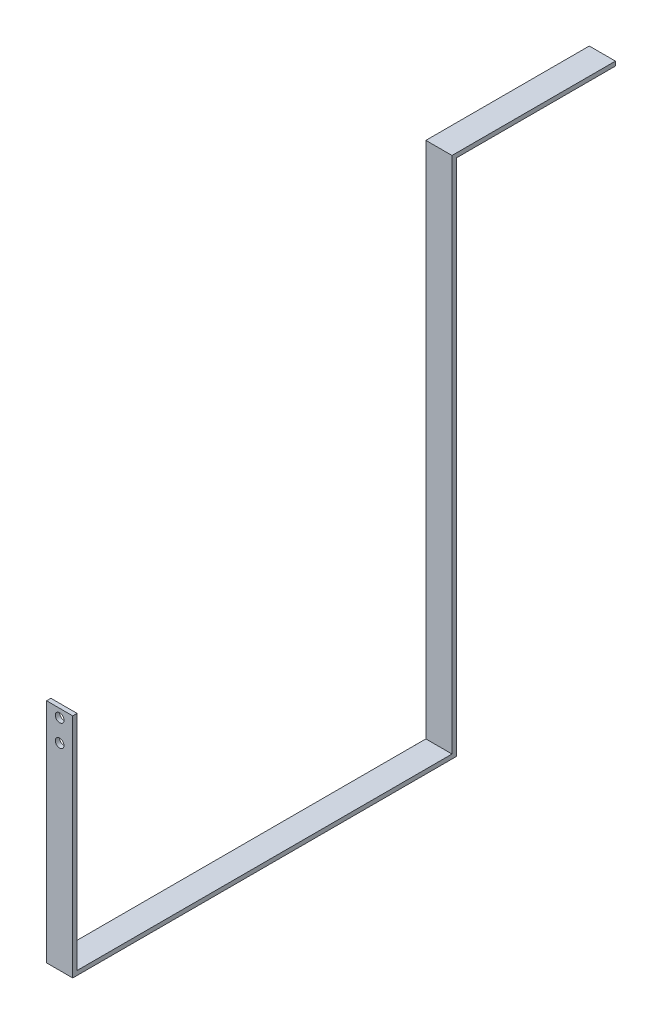
ISO-10303-21;
HEADER;
FILE_DESCRIPTION(('STEP AP214'),'2;1');
FILE_NAME('part.step','',(''),(''),'','','');
FILE_SCHEMA(('AUTOMOTIVE_DESIGN { 1 0 10303 214 1 1 1 1 }'));
ENDSEC;
DATA;
#1=APPLICATION_CONTEXT('core data for automotive mechanical design processes');
#2=APPLICATION_PROTOCOL_DEFINITION('international standard','automotive_design',2000,#1);
#3=PRODUCT_CONTEXT('',#1,'mechanical');
#4=PRODUCT('Part','Part','',(#3));
#5=PRODUCT_RELATED_PRODUCT_CATEGORY('part','',(#4));
#6=PRODUCT_DEFINITION_FORMATION('','',#4);
#7=PRODUCT_DEFINITION_CONTEXT('part definition',#1,'design');
#8=PRODUCT_DEFINITION('design','',#6,#7);
#9=PRODUCT_DEFINITION_SHAPE('','',#8);
#10=(LENGTH_UNIT() NAMED_UNIT(*) SI_UNIT(.MILLI.,.METRE.));
#11=(NAMED_UNIT(*) PLANE_ANGLE_UNIT() SI_UNIT($,.RADIAN.));
#12=(NAMED_UNIT(*) SI_UNIT($,.STERADIAN.) SOLID_ANGLE_UNIT());
#13=UNCERTAINTY_MEASURE_WITH_UNIT(LENGTH_MEASURE(1.E-05),#10,'distance_accuracy_value','');
#14=(GEOMETRIC_REPRESENTATION_CONTEXT(3) GLOBAL_UNCERTAINTY_ASSIGNED_CONTEXT((#13)) GLOBAL_UNIT_ASSIGNED_CONTEXT((#10,
#11,#12)) REPRESENTATION_CONTEXT('',''));
#15=CARTESIAN_POINT('',(0.,0.,0.));
#16=DIRECTION('',(0.,0.,1.));
#17=DIRECTION('',(1.,0.,0.));
#18=AXIS2_PLACEMENT_3D('',#15,#16,#17);
#19=CARTESIAN_POINT('',(19.05,-751.945,790.55));
#20=DIRECTION('',(0.,-1.,0.));
#21=DIRECTION('',(0.,0.,-1.));
#22=AXIS2_PLACEMENT_3D('',#19,#20,#21);
#23=PLANE('',#22);
#24=DIRECTION('',(-1.,0.,0.));
#25=VECTOR('',#24,1.);
#26=CARTESIAN_POINT('',(19.05,-751.945,784.24));
#27=LINE('',#26,#25);
#28=CARTESIAN_POINT('',(19.05,-751.945,784.24));
#29=VERTEX_POINT('',#28);
#30=CARTESIAN_POINT('',(-19.05,-751.945,784.24));
#31=VERTEX_POINT('',#30);
#32=EDGE_CURVE('E148',#29,#31,#27,.T.);
#33=ORIENTED_EDGE('',*,*,#32,.F.);
#34=DIRECTION('',(0.,0.,-1.));
#35=VECTOR('',#34,1.);
#36=CARTESIAN_POINT('',(19.05,-751.945,790.55));
#37=LINE('',#36,#35);
#38=CARTESIAN_POINT('',(19.05,-751.945,238.05));
#39=VERTEX_POINT('',#38);
#40=EDGE_CURVE('E52',#29,#39,#37,.T.);
#41=ORIENTED_EDGE('',*,*,#40,.T.);
#42=DIRECTION('',(-1.,0.,0.));
#43=VECTOR('',#42,1.);
#44=CARTESIAN_POINT('',(19.05,-751.945,238.05));
#45=LINE('',#44,#43);
#46=CARTESIAN_POINT('',(-19.05,-751.945,238.05));
#47=VERTEX_POINT('',#46);
#48=EDGE_CURVE('E123',#39,#47,#45,.T.);
#49=ORIENTED_EDGE('',*,*,#48,.T.);
#50=DIRECTION('',(0.,0.,-1.));
#51=VECTOR('',#50,1.);
#52=CARTESIAN_POINT('',(-19.05,-751.945,790.55));
#53=LINE('',#52,#51);
#54=EDGE_CURVE('E159',#31,#47,#53,.T.);
#55=ORIENTED_EDGE('',*,*,#54,.F.);
#56=EDGE_LOOP('',(#33,#41,#49,#55));
#57=FACE_BOUND('',#56,.T.);
#58=ADVANCED_FACE('F35',(#57),#23,.F.);
#59=CARTESIAN_POINT('',(0.,0.,238.05));
#60=DIRECTION('',(0.,0.,-1.));
#61=DIRECTION('',(-1.,0.,0.));
#62=AXIS2_PLACEMENT_3D('',#59,#60,#61);
#63=PLANE('',#62);
#64=ORIENTED_EDGE('',*,*,#48,.F.);
#65=DIRECTION('',(0.,1.,0.));
#66=VECTOR('',#65,1.);
#67=CARTESIAN_POINT('',(19.05,-3.155,238.05));
#68=LINE('',#67,#66);
#69=CARTESIAN_POINT('',(19.05,3.155,238.05));
#70=VERTEX_POINT('',#69);
#71=EDGE_CURVE('E178',#39,#70,#68,.T.);
#72=ORIENTED_EDGE('',*,*,#71,.T.);
#73=DIRECTION('',(-1.,0.,0.));
#74=VECTOR('',#73,1.);
#75=CARTESIAN_POINT('',(-19.05,3.155,238.05));
#76=LINE('',#75,#74);
#77=CARTESIAN_POINT('',(-19.05,3.155,238.05));
#78=VERTEX_POINT('',#77);
#79=EDGE_CURVE('E180',#70,#78,#76,.T.);
#80=ORIENTED_EDGE('',*,*,#79,.T.);
#81=DIRECTION('',(0.,-1.,0.));
#82=VECTOR('',#81,1.);
#83=CARTESIAN_POINT('',(-19.05,-3.155,238.05));
#84=LINE('',#83,#82);
#85=EDGE_CURVE('E183',#78,#47,#84,.T.);
#86=ORIENTED_EDGE('',*,*,#85,.T.);
#87=EDGE_LOOP('',(#64,#72,#80,#86));
#88=FACE_BOUND('',#87,.T.);
#89=ADVANCED_FACE('F224',(#88),#63,.F.);
#90=CARTESIAN_POINT('',(-19.05,-3.155,238.05));
#91=DIRECTION('',(0.,1.,0.));
#92=DIRECTION('',(0.,0.,1.));
#93=AXIS2_PLACEMENT_3D('',#90,#91,#92);
#94=PLANE('',#93);
#95=DIRECTION('',(1.,0.,0.));
#96=VECTOR('',#95,1.);
#97=CARTESIAN_POINT('',(19.05,-3.155,231.74));
#98=LINE('',#97,#96);
#99=CARTESIAN_POINT('',(-19.05,-3.155,231.74));
#100=VERTEX_POINT('',#99);
#101=CARTESIAN_POINT('',(19.05,-3.155,231.74));
#102=VERTEX_POINT('',#101);
#103=EDGE_CURVE('E60',#100,#102,#98,.T.);
#104=ORIENTED_EDGE('',*,*,#103,.F.);
#105=DIRECTION('',(0.,0.,-1.));
#106=VECTOR('',#105,1.);
#107=CARTESIAN_POINT('',(-19.05,-3.155,238.05));
#108=LINE('',#107,#106);
#109=CARTESIAN_POINT('',(-19.05,-3.155,0.));
#110=VERTEX_POINT('',#109);
#111=EDGE_CURVE('E196',#100,#110,#108,.T.);
#112=ORIENTED_EDGE('',*,*,#111,.T.);
#113=DIRECTION('',(1.,0.,0.));
#114=VECTOR('',#113,1.);
#115=CARTESIAN_POINT('',(-19.05,-3.155,0.));
#116=LINE('',#115,#114);
#117=CARTESIAN_POINT('',(19.05,-3.155,0.));
#118=VERTEX_POINT('',#117);
#119=EDGE_CURVE('E181',#110,#118,#116,.T.);
#120=ORIENTED_EDGE('',*,*,#119,.T.);
#121=DIRECTION('',(0.,0.,-1.));
#122=VECTOR('',#121,1.);
#123=CARTESIAN_POINT('',(19.05,-3.155,238.05));
#124=LINE('',#123,#122);
#125=EDGE_CURVE('E186',#102,#118,#124,.T.);
#126=ORIENTED_EDGE('',*,*,#125,.F.);
#127=EDGE_LOOP('',(#104,#112,#120,#126));
#128=FACE_BOUND('',#127,.T.);
#129=ADVANCED_FACE('F210',(#128),#94,.F.);
#130=CARTESIAN_POINT('',(19.05,-3.155,238.05));
#131=DIRECTION('',(-1.,0.,0.));
#132=DIRECTION('',(0.,0.,1.));
#133=AXIS2_PLACEMENT_3D('',#130,#131,#132);
#134=PLANE('',#133);
#135=DIRECTION('',(0.,1.,0.));
#136=VECTOR('',#135,1.);
#137=CARTESIAN_POINT('',(19.05,-3.155,0.));
#138=LINE('',#137,#136);
#139=CARTESIAN_POINT('',(19.05,3.155,0.));
#140=VERTEX_POINT('',#139);
#141=EDGE_CURVE('E177',#118,#140,#138,.T.);
#142=ORIENTED_EDGE('',*,*,#141,.T.);
#143=DIRECTION('',(0.,0.,-1.));
#144=VECTOR('',#143,1.);
#145=CARTESIAN_POINT('',(19.05,3.155,238.05));
#146=LINE('',#145,#144);
#147=EDGE_CURVE('E11',#70,#140,#146,.T.);
#148=ORIENTED_EDGE('',*,*,#147,.F.);
#149=ORIENTED_EDGE('',*,*,#71,.F.);
#150=ORIENTED_EDGE('',*,*,#40,.F.);
#151=DIRECTION('',(0.,-1.,0.));
#152=VECTOR('',#151,1.);
#153=CARTESIAN_POINT('',(19.05,-437.555,784.24));
#154=LINE('',#153,#152);
#155=CARTESIAN_POINT('',(19.05,-427.555,784.24));
#156=VERTEX_POINT('',#155);
#157=EDGE_CURVE('E115',#156,#29,#154,.T.);
#158=ORIENTED_EDGE('',*,*,#157,.F.);
#159=DIRECTION('',(0.,0.,-1.));
#160=VECTOR('',#159,1.);
#161=CARTESIAN_POINT('',(19.05,-427.555,784.24));
#162=LINE('',#161,#160);
#163=CARTESIAN_POINT('',(19.05,-427.555,790.55));
#164=VERTEX_POINT('',#163);
#165=EDGE_CURVE('E120',#164,#156,#162,.T.);
#166=ORIENTED_EDGE('',*,*,#165,.F.);
#167=DIRECTION('',(0.,1.,0.));
#168=VECTOR('',#167,1.);
#169=CARTESIAN_POINT('',(19.05,-758.255,790.55));
#170=LINE('',#169,#168);
#171=CARTESIAN_POINT('',(19.05,-758.255,790.55));
#172=VERTEX_POINT('',#171);
#173=EDGE_CURVE('E157',#172,#164,#170,.T.);
#174=ORIENTED_EDGE('',*,*,#173,.F.);
#175=DIRECTION('',(0.,0.,1.));
#176=VECTOR('',#175,1.);
#177=CARTESIAN_POINT('',(19.05,-758.255,238.05));
#178=LINE('',#177,#176);
#179=CARTESIAN_POINT('',(19.05,-758.255,231.74));
#180=VERTEX_POINT('',#179);
#181=EDGE_CURVE('E168',#180,#172,#178,.T.);
#182=ORIENTED_EDGE('',*,*,#181,.F.);
#183=DIRECTION('',(0.,1.,0.));
#184=VECTOR('',#183,1.);
#185=CARTESIAN_POINT('',(19.05,-758.255,231.74));
#186=LINE('',#185,#184);
#187=EDGE_CURVE('E170',#180,#102,#186,.T.);
#188=ORIENTED_EDGE('',*,*,#187,.T.);
#189=ORIENTED_EDGE('',*,*,#125,.T.);
#190=EDGE_LOOP('',(#142,#148,#149,#150,#158,#166,#174,#182,#188,#189));
#191=FACE_BOUND('',#190,.T.);
#192=ADVANCED_FACE('F37',(#191),#134,.F.);
#193=CARTESIAN_POINT('',(-19.05,3.155,238.05));
#194=DIRECTION('',(0.,-1.,0.));
#195=DIRECTION('',(0.,0.,-1.));
#196=AXIS2_PLACEMENT_3D('',#193,#194,#195);
#197=PLANE('',#196);
#198=DIRECTION('',(-1.,0.,0.));
#199=VECTOR('',#198,1.);
#200=CARTESIAN_POINT('',(-19.05,3.155,0.));
#201=LINE('',#200,#199);
#202=CARTESIAN_POINT('',(-19.05,3.155,0.));
#203=VERTEX_POINT('',#202);
#204=EDGE_CURVE('E188',#140,#203,#201,.T.);
#205=ORIENTED_EDGE('',*,*,#204,.T.);
#206=DIRECTION('',(0.,0.,-1.));
#207=VECTOR('',#206,1.);
#208=CARTESIAN_POINT('',(-19.05,3.155,238.05));
#209=LINE('',#208,#207);
#210=EDGE_CURVE('E44',#78,#203,#209,.T.);
#211=ORIENTED_EDGE('',*,*,#210,.F.);
#212=ORIENTED_EDGE('',*,*,#79,.F.);
#213=ORIENTED_EDGE('',*,*,#147,.T.);
#214=EDGE_LOOP('',(#205,#211,#212,#213));
#215=FACE_BOUND('',#214,.T.);
#216=ADVANCED_FACE('F222',(#215),#197,.F.);
#217=CARTESIAN_POINT('',(-19.05,-3.155,238.05));
#218=DIRECTION('',(1.,0.,0.));
#219=DIRECTION('',(0.,0.,-1.));
#220=AXIS2_PLACEMENT_3D('',#217,#218,#219);
#221=PLANE('',#220);
#222=DIRECTION('',(0.,-1.,0.));
#223=VECTOR('',#222,1.);
#224=CARTESIAN_POINT('',(-19.05,-3.155,0.));
#225=LINE('',#224,#223);
#226=EDGE_CURVE('E190',#203,#110,#225,.T.);
#227=ORIENTED_EDGE('',*,*,#226,.T.);
#228=ORIENTED_EDGE('',*,*,#111,.F.);
#229=DIRECTION('',(0.,1.,0.));
#230=VECTOR('',#229,1.);
#231=CARTESIAN_POINT('',(-19.05,-758.255,231.74));
#232=LINE('',#231,#230);
#233=CARTESIAN_POINT('',(-19.05,-758.255,231.74));
#234=VERTEX_POINT('',#233);
#235=EDGE_CURVE('E174',#234,#100,#232,.T.);
#236=ORIENTED_EDGE('',*,*,#235,.F.);
#237=DIRECTION('',(0.,0.,-1.));
#238=VECTOR('',#237,1.);
#239=CARTESIAN_POINT('',(-19.05,-758.255,231.74));
#240=LINE('',#239,#238);
#241=CARTESIAN_POINT('',(-19.05,-758.255,790.55));
#242=VERTEX_POINT('',#241);
#243=EDGE_CURVE('E163',#242,#234,#240,.T.);
#244=ORIENTED_EDGE('',*,*,#243,.F.);
#245=DIRECTION('',(0.,-1.,0.));
#246=VECTOR('',#245,1.);
#247=CARTESIAN_POINT('',(-19.05,-751.945,790.55));
#248=LINE('',#247,#246);
#249=CARTESIAN_POINT('',(-19.05,-427.555,790.55));
#250=VERTEX_POINT('',#249);
#251=EDGE_CURVE('E151',#250,#242,#248,.T.);
#252=ORIENTED_EDGE('',*,*,#251,.F.);
#253=DIRECTION('',(0.,0.,1.));
#254=VECTOR('',#253,1.);
#255=CARTESIAN_POINT('',(-19.05,-427.555,790.55));
#256=LINE('',#255,#254);
#257=CARTESIAN_POINT('',(-19.05,-427.555,784.24));
#258=VERTEX_POINT('',#257);
#259=EDGE_CURVE('E133',#258,#250,#256,.T.);
#260=ORIENTED_EDGE('',*,*,#259,.F.);
#261=DIRECTION('',(0.,-1.,0.));
#262=VECTOR('',#261,1.);
#263=CARTESIAN_POINT('',(-19.05,-437.555,784.24));
#264=LINE('',#263,#262);
#265=EDGE_CURVE('E124',#258,#31,#264,.T.);
#266=ORIENTED_EDGE('',*,*,#265,.T.);
#267=ORIENTED_EDGE('',*,*,#54,.T.);
#268=ORIENTED_EDGE('',*,*,#85,.F.);
#269=ORIENTED_EDGE('',*,*,#210,.T.);
#270=EDGE_LOOP('',(#227,#228,#236,#244,#252,#260,#266,#267,#268,#269));
#271=FACE_BOUND('',#270,.T.);
#272=ADVANCED_FACE('F203',(#271),#221,.F.);
#273=CARTESIAN_POINT('',(0.,0.,0.));
#274=DIRECTION('',(0.,0.,-1.));
#275=DIRECTION('',(-1.,0.,0.));
#276=AXIS2_PLACEMENT_3D('',#273,#274,#275);
#277=PLANE('',#276);
#278=ORIENTED_EDGE('',*,*,#141,.F.);
#279=ORIENTED_EDGE('',*,*,#119,.F.);
#280=ORIENTED_EDGE('',*,*,#226,.F.);
#281=ORIENTED_EDGE('',*,*,#204,.F.);
#282=EDGE_LOOP('',(#278,#279,#280,#281));
#283=FACE_BOUND('',#282,.T.);
#284=ADVANCED_FACE('F209',(#283),#277,.T.);
#285=CARTESIAN_POINT('',(19.05,-758.255,231.74));
#286=DIRECTION('',(0.,0.,1.));
#287=DIRECTION('',(1.,0.,0.));
#288=AXIS2_PLACEMENT_3D('',#285,#286,#287);
#289=PLANE('',#288);
#290=ORIENTED_EDGE('',*,*,#103,.T.);
#291=ORIENTED_EDGE('',*,*,#187,.F.);
#292=DIRECTION('',(1.,0.,0.));
#293=VECTOR('',#292,1.);
#294=CARTESIAN_POINT('',(19.05,-758.255,231.74));
#295=LINE('',#294,#293);
#296=EDGE_CURVE('E166',#234,#180,#295,.T.);
#297=ORIENTED_EDGE('',*,*,#296,.F.);
#298=ORIENTED_EDGE('',*,*,#235,.T.);
#299=EDGE_LOOP('',(#290,#291,#297,#298));
#300=FACE_BOUND('',#299,.T.);
#301=ADVANCED_FACE('F213',(#300),#289,.F.);
#302=CARTESIAN_POINT('',(0.,-758.255,0.));
#303=DIRECTION('',(0.,1.,0.));
#304=DIRECTION('',(0.,0.,1.));
#305=AXIS2_PLACEMENT_3D('',#302,#303,#304);
#306=PLANE('',#305);
#307=ORIENTED_EDGE('',*,*,#243,.T.);
#308=ORIENTED_EDGE('',*,*,#296,.T.);
#309=ORIENTED_EDGE('',*,*,#181,.T.);
#310=DIRECTION('',(1.,0.,0.));
#311=VECTOR('',#310,1.);
#312=CARTESIAN_POINT('',(-19.05,-758.255,790.55));
#313=LINE('',#312,#311);
#314=EDGE_CURVE('E154',#242,#172,#313,.T.);
#315=ORIENTED_EDGE('',*,*,#314,.F.);
#316=EDGE_LOOP('',(#307,#308,#309,#315));
#317=FACE_BOUND('',#316,.T.);
#318=ADVANCED_FACE('F218',(#317),#306,.F.);
#319=CARTESIAN_POINT('',(0.,0.,790.55));
#320=DIRECTION('',(0.,0.,1.));
#321=DIRECTION('',(1.,0.,0.));
#322=AXIS2_PLACEMENT_3D('',#319,#320,#321);
#323=PLANE('',#322);
#324=CARTESIAN_POINT('',(0.,-439.447204665717,790.55));
#325=DIRECTION('',(0.,0.,1.));
#326=DIRECTION('',(1.,0.,0.));
#327=AXIS2_PLACEMENT_3D('',#324,#325,#326);
#328=CIRCLE('',#327,6.34999999984436);
#329=CARTESIAN_POINT('',(6.34999999984436,-439.447204665717,790.55));
#330=VERTEX_POINT('',#329);
#331=EDGE_CURVE('E307',#330,#330,#328,.T.);
#332=ORIENTED_EDGE('',*,*,#331,.F.);
#333=EDGE_LOOP('',(#332));
#334=FACE_BOUND('',#333,.T.);
#335=CARTESIAN_POINT('',(0.,-471.447204665691,790.55));
#336=DIRECTION('',(0.,0.,1.));
#337=DIRECTION('',(1.,0.,0.));
#338=AXIS2_PLACEMENT_3D('',#335,#336,#337);
#339=CIRCLE('',#338,6.35000000026876);
#340=CARTESIAN_POINT('',(6.35000000026876,-471.447204665691,790.55));
#341=VERTEX_POINT('',#340);
#342=EDGE_CURVE('E142',#341,#341,#339,.T.);
#343=ORIENTED_EDGE('',*,*,#342,.F.);
#344=EDGE_LOOP('',(#343));
#345=FACE_BOUND('',#344,.T.);
#346=ORIENTED_EDGE('',*,*,#251,.T.);
#347=ORIENTED_EDGE('',*,*,#314,.T.);
#348=ORIENTED_EDGE('',*,*,#173,.T.);
#349=DIRECTION('',(1.,0.,0.));
#350=VECTOR('',#349,1.);
#351=CARTESIAN_POINT('',(19.05,-427.555,790.55));
#352=LINE('',#351,#350);
#353=EDGE_CURVE('E138',#250,#164,#352,.T.);
#354=ORIENTED_EDGE('',*,*,#353,.F.);
#355=EDGE_LOOP('',(#346,#347,#348,#354));
#356=FACE_BOUND('',#355,.T.);
#357=ADVANCED_FACE('F220',(#334,#345,#356),#323,.T.);
#358=CARTESIAN_POINT('',(19.05,-437.555,784.24));
#359=DIRECTION('',(0.,0.,1.));
#360=DIRECTION('',(1.,0.,0.));
#361=AXIS2_PLACEMENT_3D('',#358,#359,#360);
#362=PLANE('',#361);
#363=CARTESIAN_POINT('',(0.,-439.447204665717,784.24));
#364=DIRECTION('',(0.,0.,1.));
#365=DIRECTION('',(1.,0.,0.));
#366=AXIS2_PLACEMENT_3D('',#363,#364,#365);
#367=CIRCLE('',#366,6.34999999984436);
#368=CARTESIAN_POINT('',(6.34999999984436,-439.447204665717,784.24));
#369=VERTEX_POINT('',#368);
#370=EDGE_CURVE('E39',#369,#369,#367,.T.);
#371=ORIENTED_EDGE('',*,*,#370,.T.);
#372=EDGE_LOOP('',(#371));
#373=FACE_BOUND('',#372,.T.);
#374=CARTESIAN_POINT('',(0.,-471.447204665691,784.24));
#375=DIRECTION('',(0.,0.,1.));
#376=DIRECTION('',(1.,0.,0.));
#377=AXIS2_PLACEMENT_3D('',#374,#375,#376);
#378=CIRCLE('',#377,6.35000000026876);
#379=CARTESIAN_POINT('',(6.35000000026876,-471.447204665691,784.24));
#380=VERTEX_POINT('',#379);
#381=EDGE_CURVE('E139',#380,#380,#378,.T.);
#382=ORIENTED_EDGE('',*,*,#381,.T.);
#383=EDGE_LOOP('',(#382));
#384=FACE_BOUND('',#383,.T.);
#385=ORIENTED_EDGE('',*,*,#32,.T.);
#386=ORIENTED_EDGE('',*,*,#265,.F.);
#387=DIRECTION('',(-1.,0.,0.));
#388=VECTOR('',#387,1.);
#389=CARTESIAN_POINT('',(-19.05,-427.555,784.24));
#390=LINE('',#389,#388);
#391=EDGE_CURVE('E127',#156,#258,#390,.T.);
#392=ORIENTED_EDGE('',*,*,#391,.F.);
#393=ORIENTED_EDGE('',*,*,#157,.T.);
#394=EDGE_LOOP('',(#385,#386,#392,#393));
#395=FACE_BOUND('',#394,.T.);
#396=ADVANCED_FACE('F128',(#373,#384,#395),#362,.F.);
#397=CARTESIAN_POINT('',(0.,-427.555,0.));
#398=DIRECTION('',(0.,-1.,0.));
#399=DIRECTION('',(0.,0.,-1.));
#400=AXIS2_PLACEMENT_3D('',#397,#398,#399);
#401=PLANE('',#400);
#402=ORIENTED_EDGE('',*,*,#165,.T.);
#403=ORIENTED_EDGE('',*,*,#391,.T.);
#404=ORIENTED_EDGE('',*,*,#259,.T.);
#405=ORIENTED_EDGE('',*,*,#353,.T.);
#406=EDGE_LOOP('',(#402,#403,#404,#405));
#407=FACE_BOUND('',#406,.T.);
#408=ADVANCED_FACE('F136',(#407),#401,.F.);
#409=CARTESIAN_POINT('',(0.,-471.447204665691,780.55));
#410=DIRECTION('',(0.,0.,1.));
#411=DIRECTION('',(1.,0.,0.));
#412=AXIS2_PLACEMENT_3D('',#409,#410,#411);
#413=CYLINDRICAL_SURFACE('',#412,6.35000000026876);
#414=ORIENTED_EDGE('',*,*,#342,.T.);
#415=EDGE_LOOP('',(#414));
#416=FACE_BOUND('',#415,.T.);
#417=ORIENTED_EDGE('',*,*,#381,.F.);
#418=EDGE_LOOP('',(#417));
#419=FACE_BOUND('',#418,.T.);
#420=ADVANCED_FACE('F282',(#416,#419),#413,.F.);
#421=CARTESIAN_POINT('',(0.,-439.447204665717,780.55));
#422=DIRECTION('',(0.,0.,1.));
#423=DIRECTION('',(1.,0.,0.));
#424=AXIS2_PLACEMENT_3D('',#421,#422,#423);
#425=CYLINDRICAL_SURFACE('',#424,6.34999999984436);
#426=ORIENTED_EDGE('',*,*,#331,.T.);
#427=EDGE_LOOP('',(#426));
#428=FACE_BOUND('',#427,.T.);
#429=ORIENTED_EDGE('',*,*,#370,.F.);
#430=EDGE_LOOP('',(#429));
#431=FACE_BOUND('',#430,.T.);
#432=ADVANCED_FACE('F287',(#428,#431),#425,.F.);
#433=CLOSED_SHELL('',(#58,#89,#129,#192,#216,#272,#284,#301,#318,#357,#396,#408,#420,#432));
#434=MANIFOLD_SOLID_BREP('B2',#433);
#435=ADVANCED_BREP_SHAPE_REPRESENTATION('',(#18,#434),#14);
#436=SHAPE_DEFINITION_REPRESENTATION(#9,#435);
ENDSEC;
END-ISO-10303-21;
